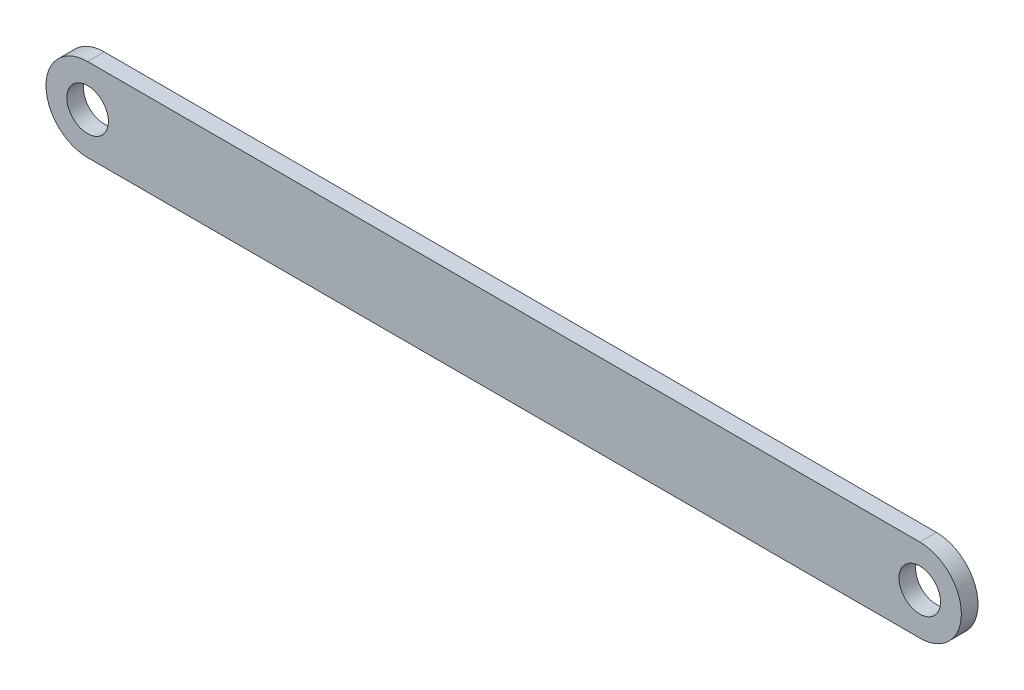
ISO-10303-21;
HEADER;
FILE_DESCRIPTION(('STEP AP214'),'2;1');
FILE_NAME('part.step','',(''),(''),'','','');
FILE_SCHEMA(('AUTOMOTIVE_DESIGN { 1 0 10303 214 1 1 1 1 }'));
ENDSEC;
DATA;
#1=APPLICATION_CONTEXT('core data for automotive mechanical design processes');
#2=APPLICATION_PROTOCOL_DEFINITION('international standard','automotive_design',2000,#1);
#3=PRODUCT_CONTEXT('',#1,'mechanical');
#4=PRODUCT('Part','Part','',(#3));
#5=PRODUCT_RELATED_PRODUCT_CATEGORY('part','',(#4));
#6=PRODUCT_DEFINITION_FORMATION('','',#4);
#7=PRODUCT_DEFINITION_CONTEXT('part definition',#1,'design');
#8=PRODUCT_DEFINITION('design','',#6,#7);
#9=PRODUCT_DEFINITION_SHAPE('','',#8);
#10=(LENGTH_UNIT() NAMED_UNIT(*) SI_UNIT(.MILLI.,.METRE.));
#11=(NAMED_UNIT(*) PLANE_ANGLE_UNIT() SI_UNIT($,.RADIAN.));
#12=(NAMED_UNIT(*) SI_UNIT($,.STERADIAN.) SOLID_ANGLE_UNIT());
#13=UNCERTAINTY_MEASURE_WITH_UNIT(LENGTH_MEASURE(1.E-05),#10,'distance_accuracy_value','');
#14=(GEOMETRIC_REPRESENTATION_CONTEXT(3) GLOBAL_UNCERTAINTY_ASSIGNED_CONTEXT((#13)) GLOBAL_UNIT_ASSIGNED_CONTEXT((#10,
#11,#12)) REPRESENTATION_CONTEXT('',''));
#15=CARTESIAN_POINT('',(0.,0.,0.));
#16=DIRECTION('',(0.,0.,1.));
#17=DIRECTION('',(1.,0.,0.));
#18=AXIS2_PLACEMENT_3D('',#15,#16,#17);
#19=CARTESIAN_POINT('',(-52.4425287356322,0.,2.));
#20=DIRECTION('',(0.,0.,1.));
#21=DIRECTION('',(1.,0.,0.));
#22=AXIS2_PLACEMENT_3D('',#19,#20,#21);
#23=PLANE('',#22);
#24=CARTESIAN_POINT('',(-52.4425287356322,0.,2.));
#25=DIRECTION('',(0.,0.,1.));
#26=DIRECTION('',(1.,0.,0.));
#27=AXIS2_PLACEMENT_3D('',#24,#25,#26);
#28=CIRCLE('',#27,2.5);
#29=CARTESIAN_POINT('',(-49.9425287356322,0.,2.));
#30=VERTEX_POINT('',#29);
#31=EDGE_CURVE('E110',#30,#30,#28,.T.);
#32=ORIENTED_EDGE('',*,*,#31,.F.);
#33=EDGE_LOOP('',(#32));
#34=FACE_BOUND('',#33,.T.);
#35=CARTESIAN_POINT('',(-52.4425287356322,0.,2.));
#36=DIRECTION('',(0.,0.,1.));
#37=DIRECTION('',(1.,0.,0.));
#38=AXIS2_PLACEMENT_3D('',#35,#36,#37);
#39=CIRCLE('',#38,5.);
#40=CARTESIAN_POINT('',(-52.4425287356322,5.,2.));
#41=VERTEX_POINT('',#40);
#42=CARTESIAN_POINT('',(-52.4425287356322,-5.,2.));
#43=VERTEX_POINT('',#42);
#44=EDGE_CURVE('E95',#41,#43,#39,.T.);
#45=ORIENTED_EDGE('',*,*,#44,.T.);
#46=DIRECTION('',(1.,0.,0.));
#47=VECTOR('',#46,1.);
#48=CARTESIAN_POINT('',(-52.4425287356322,-5.,2.));
#49=LINE('',#48,#47);
#50=CARTESIAN_POINT('',(47.5574712643678,-5.,2.));
#51=VERTEX_POINT('',#50);
#52=EDGE_CURVE('E90',#43,#51,#49,.T.);
#53=ORIENTED_EDGE('',*,*,#52,.T.);
#54=CARTESIAN_POINT('',(47.5574712643678,0.,2.));
#55=DIRECTION('',(0.,0.,1.));
#56=DIRECTION('',(1.,0.,0.));
#57=AXIS2_PLACEMENT_3D('',#54,#55,#56);
#58=CIRCLE('',#57,5.);
#59=CARTESIAN_POINT('',(47.5574712643678,5.,2.));
#60=VERTEX_POINT('',#59);
#61=EDGE_CURVE('E93',#51,#60,#58,.T.);
#62=ORIENTED_EDGE('',*,*,#61,.T.);
#63=DIRECTION('',(-1.,0.,0.));
#64=VECTOR('',#63,1.);
#65=CARTESIAN_POINT('',(-52.4425287356322,5.,2.));
#66=LINE('',#65,#64);
#67=EDGE_CURVE('E60',#60,#41,#66,.T.);
#68=ORIENTED_EDGE('',*,*,#67,.T.);
#69=EDGE_LOOP('',(#45,#53,#62,#68));
#70=FACE_BOUND('',#69,.T.);
#71=CARTESIAN_POINT('',(47.5574712643678,0.,2.));
#72=DIRECTION('',(0.,0.,1.));
#73=DIRECTION('',(1.,0.,0.));
#74=AXIS2_PLACEMENT_3D('',#71,#72,#73);
#75=CIRCLE('',#74,2.5);
#76=CARTESIAN_POINT('',(50.0574712643678,0.,2.));
#77=VERTEX_POINT('',#76);
#78=EDGE_CURVE('E125',#77,#77,#75,.T.);
#79=ORIENTED_EDGE('',*,*,#78,.F.);
#80=EDGE_LOOP('',(#79));
#81=FACE_BOUND('',#80,.T.);
#82=ADVANCED_FACE('F43',(#34,#70,#81),#23,.T.);
#83=CARTESIAN_POINT('',(-52.4425287356322,0.,0.));
#84=DIRECTION('',(0.,0.,1.));
#85=DIRECTION('',(1.,0.,0.));
#86=AXIS2_PLACEMENT_3D('',#83,#84,#85);
#87=PLANE('',#86);
#88=CARTESIAN_POINT('',(-52.4425287356322,0.,0.));
#89=DIRECTION('',(0.,0.,1.));
#90=DIRECTION('',(1.,0.,0.));
#91=AXIS2_PLACEMENT_3D('',#88,#89,#90);
#92=CIRCLE('',#91,5.);
#93=CARTESIAN_POINT('',(-52.4425287356322,5.,0.));
#94=VERTEX_POINT('',#93);
#95=CARTESIAN_POINT('',(-52.4425287356322,-5.,0.));
#96=VERTEX_POINT('',#95);
#97=EDGE_CURVE('E107',#94,#96,#92,.T.);
#98=ORIENTED_EDGE('',*,*,#97,.F.);
#99=DIRECTION('',(-1.,0.,0.));
#100=VECTOR('',#99,1.);
#101=CARTESIAN_POINT('',(-52.4425287356322,5.,0.));
#102=LINE('',#101,#100);
#103=CARTESIAN_POINT('',(47.5574712643678,5.,0.));
#104=VERTEX_POINT('',#103);
#105=EDGE_CURVE('E83',#104,#94,#102,.T.);
#106=ORIENTED_EDGE('',*,*,#105,.F.);
#107=CARTESIAN_POINT('',(47.5574712643678,0.,0.));
#108=DIRECTION('',(0.,0.,1.));
#109=DIRECTION('',(1.,0.,0.));
#110=AXIS2_PLACEMENT_3D('',#107,#108,#109);
#111=CIRCLE('',#110,5.);
#112=CARTESIAN_POINT('',(47.5574712643678,-5.,0.));
#113=VERTEX_POINT('',#112);
#114=EDGE_CURVE('E77',#113,#104,#111,.T.);
#115=ORIENTED_EDGE('',*,*,#114,.F.);
#116=DIRECTION('',(1.,0.,0.));
#117=VECTOR('',#116,1.);
#118=CARTESIAN_POINT('',(-52.4425287356322,-5.,0.));
#119=LINE('',#118,#117);
#120=EDGE_CURVE('E99',#96,#113,#119,.T.);
#121=ORIENTED_EDGE('',*,*,#120,.F.);
#122=EDGE_LOOP('',(#98,#106,#115,#121));
#123=FACE_BOUND('',#122,.T.);
#124=CARTESIAN_POINT('',(-52.4425287356322,0.,0.));
#125=DIRECTION('',(0.,0.,1.));
#126=DIRECTION('',(1.,0.,0.));
#127=AXIS2_PLACEMENT_3D('',#124,#125,#126);
#128=CIRCLE('',#127,2.5);
#129=CARTESIAN_POINT('',(-49.9425287356322,0.,0.));
#130=VERTEX_POINT('',#129);
#131=EDGE_CURVE('E122',#130,#130,#128,.T.);
#132=ORIENTED_EDGE('',*,*,#131,.T.);
#133=EDGE_LOOP('',(#132));
#134=FACE_BOUND('',#133,.T.);
#135=CARTESIAN_POINT('',(47.5574712643678,0.,0.));
#136=DIRECTION('',(0.,0.,1.));
#137=DIRECTION('',(1.,0.,0.));
#138=AXIS2_PLACEMENT_3D('',#135,#136,#137);
#139=CIRCLE('',#138,2.5);
#140=CARTESIAN_POINT('',(50.0574712643678,0.,0.));
#141=VERTEX_POINT('',#140);
#142=EDGE_CURVE('E128',#141,#141,#139,.T.);
#143=ORIENTED_EDGE('',*,*,#142,.T.);
#144=EDGE_LOOP('',(#143));
#145=FACE_BOUND('',#144,.T.);
#146=ADVANCED_FACE('F118',(#123,#134,#145),#87,.F.);
#147=CARTESIAN_POINT('',(-52.4425287356322,0.,2.));
#148=DIRECTION('',(0.,0.,-1.));
#149=DIRECTION('',(-1.,0.,0.));
#150=AXIS2_PLACEMENT_3D('',#147,#148,#149);
#151=CYLINDRICAL_SURFACE('',#150,5.);
#152=ORIENTED_EDGE('',*,*,#97,.T.);
#153=DIRECTION('',(0.,0.,-1.));
#154=VECTOR('',#153,1.);
#155=CARTESIAN_POINT('',(-52.4425287356322,-5.,2.));
#156=LINE('',#155,#154);
#157=EDGE_CURVE('E11',#43,#96,#156,.T.);
#158=ORIENTED_EDGE('',*,*,#157,.F.);
#159=ORIENTED_EDGE('',*,*,#44,.F.);
#160=DIRECTION('',(0.,0.,-1.));
#161=VECTOR('',#160,1.);
#162=CARTESIAN_POINT('',(-52.4425287356322,5.,2.));
#163=LINE('',#162,#161);
#164=EDGE_CURVE('E103',#41,#94,#163,.T.);
#165=ORIENTED_EDGE('',*,*,#164,.T.);
#166=EDGE_LOOP('',(#152,#158,#159,#165));
#167=FACE_BOUND('',#166,.T.);
#168=ADVANCED_FACE('F45',(#167),#151,.T.);
#169=CARTESIAN_POINT('',(-52.4425287356322,-5.,2.));
#170=DIRECTION('',(0.,1.,0.));
#171=DIRECTION('',(0.,0.,1.));
#172=AXIS2_PLACEMENT_3D('',#169,#170,#171);
#173=PLANE('',#172);
#174=ORIENTED_EDGE('',*,*,#120,.T.);
#175=DIRECTION('',(0.,0.,-1.));
#176=VECTOR('',#175,1.);
#177=CARTESIAN_POINT('',(47.5574712643678,-5.,2.));
#178=LINE('',#177,#176);
#179=EDGE_CURVE('E52',#51,#113,#178,.T.);
#180=ORIENTED_EDGE('',*,*,#179,.F.);
#181=ORIENTED_EDGE('',*,*,#52,.F.);
#182=ORIENTED_EDGE('',*,*,#157,.T.);
#183=EDGE_LOOP('',(#174,#180,#181,#182));
#184=FACE_BOUND('',#183,.T.);
#185=ADVANCED_FACE('F98',(#184),#173,.F.);
#186=CARTESIAN_POINT('',(47.5574712643678,0.,2.));
#187=DIRECTION('',(0.,0.,-1.));
#188=DIRECTION('',(-1.,0.,0.));
#189=AXIS2_PLACEMENT_3D('',#186,#187,#188);
#190=CYLINDRICAL_SURFACE('',#189,5.);
#191=ORIENTED_EDGE('',*,*,#114,.T.);
#192=DIRECTION('',(0.,0.,-1.));
#193=VECTOR('',#192,1.);
#194=CARTESIAN_POINT('',(47.5574712643678,5.,2.));
#195=LINE('',#194,#193);
#196=EDGE_CURVE('E100',#60,#104,#195,.T.);
#197=ORIENTED_EDGE('',*,*,#196,.F.);
#198=ORIENTED_EDGE('',*,*,#61,.F.);
#199=ORIENTED_EDGE('',*,*,#179,.T.);
#200=EDGE_LOOP('',(#191,#197,#198,#199));
#201=FACE_BOUND('',#200,.T.);
#202=ADVANCED_FACE('F101',(#201),#190,.T.);
#203=CARTESIAN_POINT('',(-52.4425287356322,5.,2.));
#204=DIRECTION('',(0.,-1.,0.));
#205=DIRECTION('',(0.,0.,-1.));
#206=AXIS2_PLACEMENT_3D('',#203,#204,#205);
#207=PLANE('',#206);
#208=ORIENTED_EDGE('',*,*,#105,.T.);
#209=ORIENTED_EDGE('',*,*,#164,.F.);
#210=ORIENTED_EDGE('',*,*,#67,.F.);
#211=ORIENTED_EDGE('',*,*,#196,.T.);
#212=EDGE_LOOP('',(#208,#209,#210,#211));
#213=FACE_BOUND('',#212,.T.);
#214=ADVANCED_FACE('F115',(#213),#207,.F.);
#215=CARTESIAN_POINT('',(-52.4425287356322,0.,2.));
#216=DIRECTION('',(0.,0.,-1.));
#217=DIRECTION('',(-1.,0.,0.));
#218=AXIS2_PLACEMENT_3D('',#215,#216,#217);
#219=CYLINDRICAL_SURFACE('',#218,2.5);
#220=ORIENTED_EDGE('',*,*,#31,.T.);
#221=EDGE_LOOP('',(#220));
#222=FACE_BOUND('',#221,.T.);
#223=ORIENTED_EDGE('',*,*,#131,.F.);
#224=EDGE_LOOP('',(#223));
#225=FACE_BOUND('',#224,.T.);
#226=ADVANCED_FACE('F145',(#222,#225),#219,.F.);
#227=CARTESIAN_POINT('',(47.5574712643678,0.,2.));
#228=DIRECTION('',(0.,0.,-1.));
#229=DIRECTION('',(-1.,0.,0.));
#230=AXIS2_PLACEMENT_3D('',#227,#228,#229);
#231=CYLINDRICAL_SURFACE('',#230,2.5);
#232=ORIENTED_EDGE('',*,*,#78,.T.);
#233=EDGE_LOOP('',(#232));
#234=FACE_BOUND('',#233,.T.);
#235=ORIENTED_EDGE('',*,*,#142,.F.);
#236=EDGE_LOOP('',(#235));
#237=FACE_BOUND('',#236,.T.);
#238=ADVANCED_FACE('F134',(#234,#237),#231,.F.);
#239=CLOSED_SHELL('',(#82,#146,#168,#185,#202,#214,#226,#238));
#240=MANIFOLD_SOLID_BREP('B2',#239);
#241=ADVANCED_BREP_SHAPE_REPRESENTATION('',(#18,#240),#14);
#242=SHAPE_DEFINITION_REPRESENTATION(#9,#241);
ENDSEC;
END-ISO-10303-21;
